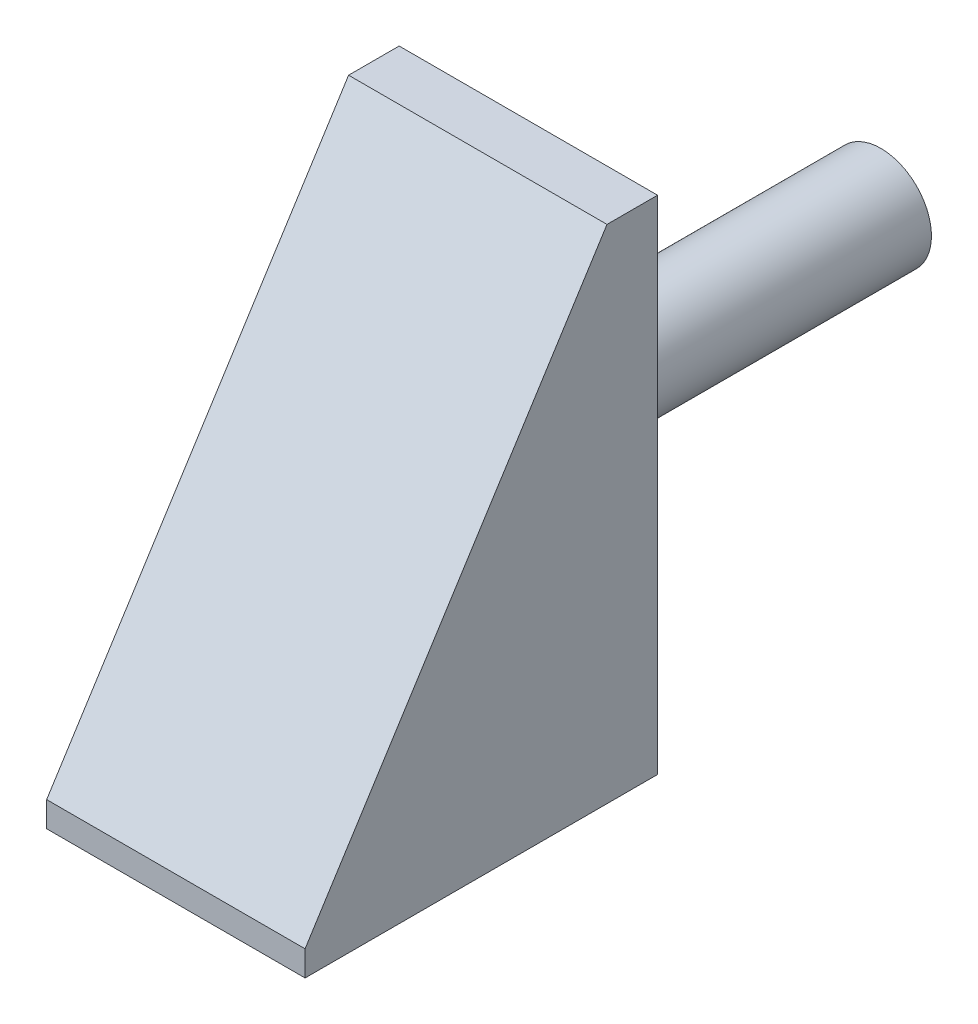
ISO-10303-21;
HEADER;
FILE_DESCRIPTION(('STEP AP214'),'2;1');
FILE_NAME('part.step','',(''),(''),'','','');
FILE_SCHEMA(('AUTOMOTIVE_DESIGN { 1 0 10303 214 1 1 1 1 }'));
ENDSEC;
DATA;
#1=APPLICATION_CONTEXT('core data for automotive mechanical design processes');
#2=APPLICATION_PROTOCOL_DEFINITION('international standard','automotive_design',2000,#1);
#3=PRODUCT_CONTEXT('',#1,'mechanical');
#4=PRODUCT('Part','Part','',(#3));
#5=PRODUCT_RELATED_PRODUCT_CATEGORY('part','',(#4));
#6=PRODUCT_DEFINITION_FORMATION('','',#4);
#7=PRODUCT_DEFINITION_CONTEXT('part definition',#1,'design');
#8=PRODUCT_DEFINITION('design','',#6,#7);
#9=PRODUCT_DEFINITION_SHAPE('','',#8);
#10=(LENGTH_UNIT() NAMED_UNIT(*) SI_UNIT(.MILLI.,.METRE.));
#11=(NAMED_UNIT(*) PLANE_ANGLE_UNIT() SI_UNIT($,.RADIAN.));
#12=(NAMED_UNIT(*) SI_UNIT($,.STERADIAN.) SOLID_ANGLE_UNIT());
#13=UNCERTAINTY_MEASURE_WITH_UNIT(LENGTH_MEASURE(1.E-05),#10,'distance_accuracy_value','');
#14=(GEOMETRIC_REPRESENTATION_CONTEXT(3) GLOBAL_UNCERTAINTY_ASSIGNED_CONTEXT((#13)) GLOBAL_UNIT_ASSIGNED_CONTEXT((#10,
#11,#12)) REPRESENTATION_CONTEXT('',''));
#15=CARTESIAN_POINT('',(0.,0.,0.));
#16=DIRECTION('',(0.,0.,1.));
#17=DIRECTION('',(1.,0.,0.));
#18=AXIS2_PLACEMENT_3D('',#15,#16,#17);
#19=CARTESIAN_POINT('',(2.555,12.82,13.33));
#20=DIRECTION('',(0.,1.,0.));
#21=DIRECTION('',(1.,0.,0.));
#22=AXIS2_PLACEMENT_3D('',#19,#20,#21);
#23=PLANE('',#22);
#24=DIRECTION('',(0.,0.,-1.));
#25=VECTOR('',#24,1.);
#26=CARTESIAN_POINT('',(-2.555,12.82,13.33));
#27=LINE('',#26,#25);
#28=CARTESIAN_POINT('',(-2.555,12.82,13.83));
#29=VERTEX_POINT('',#28);
#30=CARTESIAN_POINT('',(-2.555,12.82,12.83));
#31=VERTEX_POINT('',#30);
#32=EDGE_CURVE('E10',#29,#31,#27,.T.);
#33=ORIENTED_EDGE('',*,*,#32,.F.);
#34=DIRECTION('',(1.,0.,0.));
#35=VECTOR('',#34,1.);
#36=CARTESIAN_POINT('',(2.555,12.82,13.83));
#37=LINE('',#36,#35);
#38=CARTESIAN_POINT('',(2.555,12.82,13.83));
#39=VERTEX_POINT('',#38);
#40=EDGE_CURVE('E80',#29,#39,#37,.T.);
#41=ORIENTED_EDGE('',*,*,#40,.T.);
#42=DIRECTION('',(0.,0.,-1.));
#43=VECTOR('',#42,1.);
#44=CARTESIAN_POINT('',(2.555,12.82,13.33));
#45=LINE('',#44,#43);
#46=CARTESIAN_POINT('',(2.555,12.82,12.83));
#47=VERTEX_POINT('',#46);
#48=EDGE_CURVE('E76',#39,#47,#45,.T.);
#49=ORIENTED_EDGE('',*,*,#48,.T.);
#50=DIRECTION('',(1.,0.,0.));
#51=VECTOR('',#50,1.);
#52=CARTESIAN_POINT('',(1.2775,12.82,12.83));
#53=LINE('',#52,#51);
#54=EDGE_CURVE('E127',#31,#47,#53,.T.);
#55=ORIENTED_EDGE('',*,*,#54,.F.);
#56=EDGE_LOOP('',(#33,#41,#49,#55));
#57=FACE_BOUND('',#56,.T.);
#58=ADVANCED_FACE('F16',(#57),#23,.T.);
#59=CARTESIAN_POINT('',(-2.555,12.82,13.33));
#60=DIRECTION('',(-1.,0.,0.));
#61=DIRECTION('',(0.,0.,1.));
#62=AXIS2_PLACEMENT_3D('',#59,#60,#61);
#63=PLANE('',#62);
#64=DIRECTION('',(0.,0.,1.));
#65=VECTOR('',#64,1.);
#66=CARTESIAN_POINT('',(-2.555,2.9,13.33));
#67=LINE('',#66,#65);
#68=CARTESIAN_POINT('',(-2.555,2.9,12.83));
#69=VERTEX_POINT('',#68);
#70=CARTESIAN_POINT('',(-2.555,2.9,19.8));
#71=VERTEX_POINT('',#70);
#72=EDGE_CURVE('E64',#69,#71,#67,.T.);
#73=ORIENTED_EDGE('',*,*,#72,.T.);
#74=DIRECTION('',(0.,-1.,0.));
#75=VECTOR('',#74,1.);
#76=CARTESIAN_POINT('',(-2.555,2.9,19.8));
#77=LINE('',#76,#75);
#78=CARTESIAN_POINT('',(-2.555,3.4,19.8));
#79=VERTEX_POINT('',#78);
#80=EDGE_CURVE('E25',#79,#71,#77,.T.);
#81=ORIENTED_EDGE('',*,*,#80,.F.);
#82=DIRECTION('',(0.,0.844656912066673,-0.535308042997668));
#83=VECTOR('',#82,1.);
#84=CARTESIAN_POINT('',(-2.555,12.9330379096507,13.7583613247755));
#85=LINE('',#84,#83);
#86=EDGE_CURVE('E60',#79,#29,#85,.T.);
#87=ORIENTED_EDGE('',*,*,#86,.T.);
#88=ORIENTED_EDGE('',*,*,#32,.T.);
#89=DIRECTION('',(0.,1.,0.));
#90=VECTOR('',#89,1.);
#91=CARTESIAN_POINT('',(-2.555,10.34,12.83));
#92=LINE('',#91,#90);
#93=EDGE_CURVE('E126',#69,#31,#92,.T.);
#94=ORIENTED_EDGE('',*,*,#93,.F.);
#95=EDGE_LOOP('',(#73,#81,#87,#88,#94));
#96=FACE_BOUND('',#95,.T.);
#97=ADVANCED_FACE('F58',(#96),#63,.T.);
#98=CARTESIAN_POINT('',(0.,7.86,19.8));
#99=DIRECTION('',(0.,0.,1.));
#100=DIRECTION('',(1.,0.,0.));
#101=AXIS2_PLACEMENT_3D('',#98,#99,#100);
#102=PLANE('',#101);
#103=DIRECTION('',(-1.,0.,0.));
#104=VECTOR('',#103,1.);
#105=CARTESIAN_POINT('',(1.2775,3.4,19.8));
#106=LINE('',#105,#104);
#107=CARTESIAN_POINT('',(2.555,3.4,19.8));
#108=VERTEX_POINT('',#107);
#109=EDGE_CURVE('E68',#108,#79,#106,.T.);
#110=ORIENTED_EDGE('',*,*,#109,.T.);
#111=ORIENTED_EDGE('',*,*,#80,.T.);
#112=DIRECTION('',(1.,0.,0.));
#113=VECTOR('',#112,1.);
#114=CARTESIAN_POINT('',(2.555,2.9,19.8));
#115=LINE('',#114,#113);
#116=CARTESIAN_POINT('',(2.555,2.9,19.8));
#117=VERTEX_POINT('',#116);
#118=EDGE_CURVE('E97',#71,#117,#115,.T.);
#119=ORIENTED_EDGE('',*,*,#118,.T.);
#120=DIRECTION('',(0.,1.,0.));
#121=VECTOR('',#120,1.);
#122=CARTESIAN_POINT('',(2.555,12.82,19.8));
#123=LINE('',#122,#121);
#124=EDGE_CURVE('E71',#117,#108,#123,.T.);
#125=ORIENTED_EDGE('',*,*,#124,.T.);
#126=EDGE_LOOP('',(#110,#111,#119,#125));
#127=FACE_BOUND('',#126,.T.);
#128=ADVANCED_FACE('F69',(#127),#102,.T.);
#129=CARTESIAN_POINT('',(-2.555,2.9,13.33));
#130=DIRECTION('',(0.,-1.,0.));
#131=DIRECTION('',(0.,0.,-1.));
#132=AXIS2_PLACEMENT_3D('',#129,#130,#131);
#133=PLANE('',#132);
#134=DIRECTION('',(0.,0.,-1.));
#135=VECTOR('',#134,1.);
#136=CARTESIAN_POINT('',(2.555,2.9,13.33));
#137=LINE('',#136,#135);
#138=CARTESIAN_POINT('',(2.555,2.9,12.83));
#139=VERTEX_POINT('',#138);
#140=EDGE_CURVE('E95',#117,#139,#137,.T.);
#141=ORIENTED_EDGE('',*,*,#140,.F.);
#142=ORIENTED_EDGE('',*,*,#118,.F.);
#143=ORIENTED_EDGE('',*,*,#72,.F.);
#144=DIRECTION('',(-1.,0.,0.));
#145=VECTOR('',#144,1.);
#146=CARTESIAN_POINT('',(-1.2775,2.9,12.83));
#147=LINE('',#146,#145);
#148=EDGE_CURVE('E122',#139,#69,#147,.T.);
#149=ORIENTED_EDGE('',*,*,#148,.F.);
#150=EDGE_LOOP('',(#141,#142,#143,#149));
#151=FACE_BOUND('',#150,.T.);
#152=ADVANCED_FACE('F150',(#151),#133,.T.);
#153=CARTESIAN_POINT('',(2.555,2.9,13.33));
#154=DIRECTION('',(1.,0.,0.));
#155=DIRECTION('',(0.,1.,0.));
#156=AXIS2_PLACEMENT_3D('',#153,#154,#155);
#157=PLANE('',#156);
#158=ORIENTED_EDGE('',*,*,#48,.F.);
#159=DIRECTION('',(0.,-0.844656912066673,0.535308042997668));
#160=VECTOR('',#159,1.);
#161=CARTESIAN_POINT('',(2.555,9.39434922610476,16.0010334522457));
#162=LINE('',#161,#160);
#163=EDGE_CURVE('E87',#39,#108,#162,.T.);
#164=ORIENTED_EDGE('',*,*,#163,.T.);
#165=ORIENTED_EDGE('',*,*,#124,.F.);
#166=ORIENTED_EDGE('',*,*,#140,.T.);
#167=DIRECTION('',(0.,-1.,0.));
#168=VECTOR('',#167,1.);
#169=CARTESIAN_POINT('',(2.555,5.38,12.83));
#170=LINE('',#169,#168);
#171=EDGE_CURVE('E113',#47,#139,#170,.T.);
#172=ORIENTED_EDGE('',*,*,#171,.F.);
#173=EDGE_LOOP('',(#158,#164,#165,#166,#172));
#174=FACE_BOUND('',#173,.T.);
#175=ADVANCED_FACE('F243',(#174),#157,.T.);
#176=CARTESIAN_POINT('',(2.555,12.82,13.83));
#177=DIRECTION('',(0.,-0.535308042997668,-0.844656912066673));
#178=DIRECTION('',(0.,-0.844656912066673,0.535308042997668));
#179=AXIS2_PLACEMENT_3D('',#176,#177,#178);
#180=PLANE('',#179);
#181=ORIENTED_EDGE('',*,*,#163,.F.);
#182=ORIENTED_EDGE('',*,*,#40,.F.);
#183=ORIENTED_EDGE('',*,*,#86,.F.);
#184=ORIENTED_EDGE('',*,*,#109,.F.);
#185=EDGE_LOOP('',(#181,#182,#183,#184));
#186=FACE_BOUND('',#185,.T.);
#187=ADVANCED_FACE('F78',(#186),#180,.F.);
#188=CARTESIAN_POINT('',(0.,7.86,12.83));
#189=DIRECTION('',(0.,0.,-1.));
#190=DIRECTION('',(0.,-1.,0.));
#191=AXIS2_PLACEMENT_3D('',#188,#189,#190);
#192=PLANE('',#191);
#193=CARTESIAN_POINT('',(0.,7.86,12.83));
#194=DIRECTION('',(0.,0.,1.));
#195=DIRECTION('',(1.,0.,0.));
#196=AXIS2_PLACEMENT_3D('',#193,#194,#195);
#197=CIRCLE('',#196,1.);
#198=CARTESIAN_POINT('',(-1.,7.86,12.83));
#199=VERTEX_POINT('',#198);
#200=EDGE_CURVE('E109',#199,#199,#197,.T.);
#201=ORIENTED_EDGE('',*,*,#200,.T.);
#202=EDGE_LOOP('',(#201));
#203=FACE_BOUND('',#202,.T.);
#204=ORIENTED_EDGE('',*,*,#148,.T.);
#205=ORIENTED_EDGE('',*,*,#93,.T.);
#206=ORIENTED_EDGE('',*,*,#54,.T.);
#207=ORIENTED_EDGE('',*,*,#171,.T.);
#208=EDGE_LOOP('',(#204,#205,#206,#207));
#209=FACE_BOUND('',#208,.T.);
#210=ADVANCED_FACE('F142',(#203,#209),#192,.T.);
#211=CARTESIAN_POINT('',(0.,7.86,5.86));
#212=DIRECTION('',(0.,0.,1.));
#213=DIRECTION('',(1.,0.,0.));
#214=AXIS2_PLACEMENT_3D('',#211,#212,#213);
#215=PLANE('',#214);
#216=CARTESIAN_POINT('',(0.,7.86,5.86));
#217=DIRECTION('',(0.,0.,1.));
#218=DIRECTION('',(1.,0.,0.));
#219=AXIS2_PLACEMENT_3D('',#216,#217,#218);
#220=CIRCLE('',#219,1.);
#221=CARTESIAN_POINT('',(-1.,7.86,5.86));
#222=VERTEX_POINT('',#221);
#223=EDGE_CURVE('E118',#222,#222,#220,.T.);
#224=ORIENTED_EDGE('',*,*,#223,.F.);
#225=EDGE_LOOP('',(#224));
#226=FACE_BOUND('',#225,.T.);
#227=ADVANCED_FACE('F217',(#226),#215,.F.);
#228=CARTESIAN_POINT('',(0.,7.86,5.86));
#229=DIRECTION('',(0.,0.,1.));
#230=DIRECTION('',(1.,0.,0.));
#231=AXIS2_PLACEMENT_3D('',#228,#229,#230);
#232=CYLINDRICAL_SURFACE('',#231,1.);
#233=ORIENTED_EDGE('',*,*,#200,.F.);
#234=DIRECTION('',(0.,0.,-1.));
#235=VECTOR('',#234,1.);
#236=CARTESIAN_POINT('',(-1.,7.86,5.86));
#237=LINE('',#236,#235);
#238=EDGE_CURVE('E114',#199,#222,#237,.T.);
#239=ORIENTED_EDGE('',*,*,#238,.T.);
#240=ORIENTED_EDGE('',*,*,#223,.T.);
#241=ORIENTED_EDGE('',*,*,#238,.F.);
#242=EDGE_LOOP('',(#233,#239,#240,#241));
#243=FACE_BOUND('',#242,.T.);
#244=ADVANCED_FACE('F169',(#243),#232,.T.);
#245=CLOSED_SHELL('',(#58,#97,#128,#152,#175,#187,#210,#227,#244));
#246=MANIFOLD_SOLID_BREP('B1',#245);
#247=ADVANCED_BREP_SHAPE_REPRESENTATION('',(#18,#246),#14);
#248=SHAPE_DEFINITION_REPRESENTATION(#9,#247);
ENDSEC;
END-ISO-10303-21;
